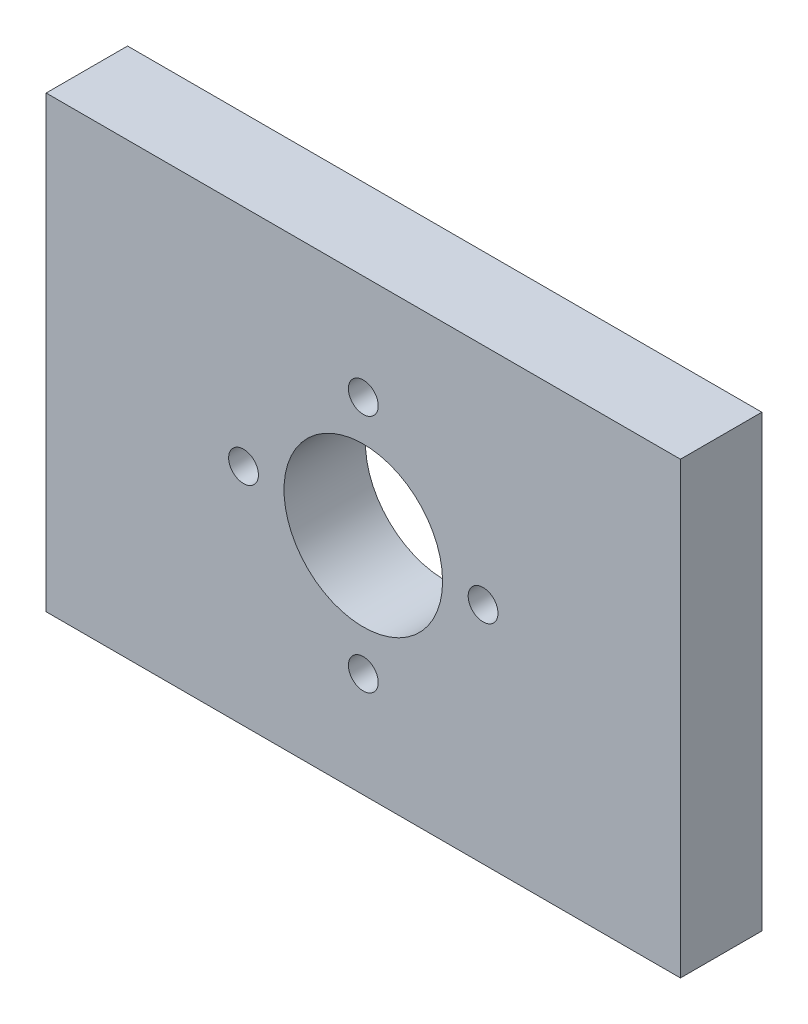
ISO-10303-21;
HEADER;
FILE_DESCRIPTION(('STEP AP214'),'2;1');
FILE_NAME('part.step','',(''),(''),'','','');
FILE_SCHEMA(('AUTOMOTIVE_DESIGN { 1 0 10303 214 1 1 1 1 }'));
ENDSEC;
DATA;
#1=APPLICATION_CONTEXT('core data for automotive mechanical design processes');
#2=APPLICATION_PROTOCOL_DEFINITION('international standard','automotive_design',2000,#1);
#3=PRODUCT_CONTEXT('',#1,'mechanical');
#4=PRODUCT('Part','Part','',(#3));
#5=PRODUCT_RELATED_PRODUCT_CATEGORY('part','',(#4));
#6=PRODUCT_DEFINITION_FORMATION('','',#4);
#7=PRODUCT_DEFINITION_CONTEXT('part definition',#1,'design');
#8=PRODUCT_DEFINITION('design','',#6,#7);
#9=PRODUCT_DEFINITION_SHAPE('','',#8);
#10=(LENGTH_UNIT() NAMED_UNIT(*) SI_UNIT(.MILLI.,.METRE.));
#11=(NAMED_UNIT(*) PLANE_ANGLE_UNIT() SI_UNIT($,.RADIAN.));
#12=(NAMED_UNIT(*) SI_UNIT($,.STERADIAN.) SOLID_ANGLE_UNIT());
#13=UNCERTAINTY_MEASURE_WITH_UNIT(LENGTH_MEASURE(1.E-05),#10,'distance_accuracy_value','');
#14=(GEOMETRIC_REPRESENTATION_CONTEXT(3) GLOBAL_UNCERTAINTY_ASSIGNED_CONTEXT((#13)) GLOBAL_UNIT_ASSIGNED_CONTEXT((#10,
#11,#12)) REPRESENTATION_CONTEXT('',''));
#15=CARTESIAN_POINT('',(0.,0.,0.));
#16=DIRECTION('',(0.,0.,1.));
#17=DIRECTION('',(1.,0.,0.));
#18=AXIS2_PLACEMENT_3D('',#15,#16,#17);
#19=CARTESIAN_POINT('',(76.2,53.975,19.558));
#20=DIRECTION('',(0.,-1.,0.));
#21=DIRECTION('',(0.,0.,-1.));
#22=AXIS2_PLACEMENT_3D('',#19,#20,#21);
#23=PLANE('',#22);
#24=DIRECTION('',(-1.,0.,0.));
#25=VECTOR('',#24,1.);
#26=CARTESIAN_POINT('',(76.2,53.975,0.));
#27=LINE('',#26,#25);
#28=CARTESIAN_POINT('',(76.2,53.975,0.));
#29=VERTEX_POINT('',#28);
#30=CARTESIAN_POINT('',(-76.2,53.975,0.));
#31=VERTEX_POINT('',#30);
#32=EDGE_CURVE('E371',#29,#31,#27,.T.);
#33=ORIENTED_EDGE('',*,*,#32,.T.);
#34=DIRECTION('',(0.,0.,-1.));
#35=VECTOR('',#34,1.);
#36=CARTESIAN_POINT('',(-76.2,53.975,19.558));
#37=LINE('',#36,#35);
#38=CARTESIAN_POINT('',(-76.2,53.975,19.558));
#39=VERTEX_POINT('',#38);
#40=EDGE_CURVE('E14',#39,#31,#37,.T.);
#41=ORIENTED_EDGE('',*,*,#40,.F.);
#42=DIRECTION('',(-1.,0.,0.));
#43=VECTOR('',#42,1.);
#44=CARTESIAN_POINT('',(76.2,53.975,19.558));
#45=LINE('',#44,#43);
#46=CARTESIAN_POINT('',(76.2,53.975,19.558));
#47=VERTEX_POINT('',#46);
#48=EDGE_CURVE('E353',#47,#39,#45,.T.);
#49=ORIENTED_EDGE('',*,*,#48,.F.);
#50=DIRECTION('',(0.,0.,-1.));
#51=VECTOR('',#50,1.);
#52=CARTESIAN_POINT('',(76.2,53.975,19.558));
#53=LINE('',#52,#51);
#54=EDGE_CURVE('E370',#47,#29,#53,.T.);
#55=ORIENTED_EDGE('',*,*,#54,.T.);
#56=EDGE_LOOP('',(#33,#41,#49,#55));
#57=FACE_BOUND('',#56,.T.);
#58=ADVANCED_FACE('F305',(#57),#23,.F.);
#59=CARTESIAN_POINT('',(-76.2,-53.975,19.558));
#60=DIRECTION('',(1.,0.,0.));
#61=DIRECTION('',(0.,0.,-1.));
#62=AXIS2_PLACEMENT_3D('',#59,#60,#61);
#63=PLANE('',#62);
#64=DIRECTION('',(0.,-1.,0.));
#65=VECTOR('',#64,1.);
#66=CARTESIAN_POINT('',(-76.2,-53.975,0.));
#67=LINE('',#66,#65);
#68=CARTESIAN_POINT('',(-76.2,-53.975,0.));
#69=VERTEX_POINT('',#68);
#70=EDGE_CURVE('E360',#31,#69,#67,.T.);
#71=ORIENTED_EDGE('',*,*,#70,.T.);
#72=DIRECTION('',(0.,0.,-1.));
#73=VECTOR('',#72,1.);
#74=CARTESIAN_POINT('',(-76.2,-53.975,19.558));
#75=LINE('',#74,#73);
#76=CARTESIAN_POINT('',(-76.2,-53.975,19.558));
#77=VERTEX_POINT('',#76);
#78=EDGE_CURVE('E311',#77,#69,#75,.T.);
#79=ORIENTED_EDGE('',*,*,#78,.F.);
#80=DIRECTION('',(0.,-1.,0.));
#81=VECTOR('',#80,1.);
#82=CARTESIAN_POINT('',(-76.2,-53.975,19.558));
#83=LINE('',#82,#81);
#84=EDGE_CURVE('E346',#39,#77,#83,.T.);
#85=ORIENTED_EDGE('',*,*,#84,.F.);
#86=ORIENTED_EDGE('',*,*,#40,.T.);
#87=EDGE_LOOP('',(#71,#79,#85,#86));
#88=FACE_BOUND('',#87,.T.);
#89=ADVANCED_FACE('F356',(#88),#63,.F.);
#90=CARTESIAN_POINT('',(76.2,-53.975,19.558));
#91=DIRECTION('',(0.,1.,0.));
#92=DIRECTION('',(0.,0.,1.));
#93=AXIS2_PLACEMENT_3D('',#90,#91,#92);
#94=PLANE('',#93);
#95=DIRECTION('',(1.,0.,0.));
#96=VECTOR('',#95,1.);
#97=CARTESIAN_POINT('',(76.2,-53.975,0.));
#98=LINE('',#97,#96);
#99=CARTESIAN_POINT('',(76.2,-53.975,0.));
#100=VERTEX_POINT('',#99);
#101=EDGE_CURVE('E337',#69,#100,#98,.T.);
#102=ORIENTED_EDGE('',*,*,#101,.T.);
#103=DIRECTION('',(0.,0.,-1.));
#104=VECTOR('',#103,1.);
#105=CARTESIAN_POINT('',(76.2,-53.975,19.558));
#106=LINE('',#105,#104);
#107=CARTESIAN_POINT('',(76.2,-53.975,19.558));
#108=VERTEX_POINT('',#107);
#109=EDGE_CURVE('E363',#108,#100,#106,.T.);
#110=ORIENTED_EDGE('',*,*,#109,.F.);
#111=DIRECTION('',(1.,0.,0.));
#112=VECTOR('',#111,1.);
#113=CARTESIAN_POINT('',(76.2,-53.975,19.558));
#114=LINE('',#113,#112);
#115=EDGE_CURVE('E355',#77,#108,#114,.T.);
#116=ORIENTED_EDGE('',*,*,#115,.F.);
#117=ORIENTED_EDGE('',*,*,#78,.T.);
#118=EDGE_LOOP('',(#102,#110,#116,#117));
#119=FACE_BOUND('',#118,.T.);
#120=ADVANCED_FACE('F365',(#119),#94,.F.);
#121=CARTESIAN_POINT('',(76.2,-53.975,19.558));
#122=DIRECTION('',(-1.,0.,0.));
#123=DIRECTION('',(0.,0.,1.));
#124=AXIS2_PLACEMENT_3D('',#121,#122,#123);
#125=PLANE('',#124);
#126=DIRECTION('',(0.,1.,0.));
#127=VECTOR('',#126,1.);
#128=CARTESIAN_POINT('',(76.2,-53.975,0.));
#129=LINE('',#128,#127);
#130=EDGE_CURVE('E345',#100,#29,#129,.T.);
#131=ORIENTED_EDGE('',*,*,#130,.T.);
#132=ORIENTED_EDGE('',*,*,#54,.F.);
#133=DIRECTION('',(0.,1.,0.));
#134=VECTOR('',#133,1.);
#135=CARTESIAN_POINT('',(76.2,-53.975,19.558));
#136=LINE('',#135,#134);
#137=EDGE_CURVE('E316',#108,#47,#136,.T.);
#138=ORIENTED_EDGE('',*,*,#137,.F.);
#139=ORIENTED_EDGE('',*,*,#109,.T.);
#140=EDGE_LOOP('',(#131,#132,#138,#139));
#141=FACE_BOUND('',#140,.T.);
#142=ADVANCED_FACE('F387',(#141),#125,.F.);
#143=CARTESIAN_POINT('',(0.,0.,19.558));
#144=DIRECTION('',(0.,0.,-1.));
#145=DIRECTION('',(-1.,0.,0.));
#146=AXIS2_PLACEMENT_3D('',#143,#144,#145);
#147=PLANE('',#146);
#148=CARTESIAN_POINT('',(0.,28.7782,19.558));
#149=DIRECTION('',(0.,0.,1.));
#150=DIRECTION('',(1.,0.,0.));
#151=AXIS2_PLACEMENT_3D('',#148,#149,#150);
#152=CIRCLE('',#151,3.5814);
#153=CARTESIAN_POINT('',(3.58139999999999,28.7782,19.558));
#154=VERTEX_POINT('',#153);
#155=EDGE_CURVE('E428',#154,#154,#152,.T.);
#156=ORIENTED_EDGE('',*,*,#155,.F.);
#157=EDGE_LOOP('',(#156));
#158=FACE_BOUND('',#157,.T.);
#159=CARTESIAN_POINT('',(28.7782,0.,19.558));
#160=DIRECTION('',(0.,0.,1.));
#161=DIRECTION('',(1.,0.,0.));
#162=AXIS2_PLACEMENT_3D('',#159,#160,#161);
#163=CIRCLE('',#162,3.5814);
#164=CARTESIAN_POINT('',(32.3596,0.,19.558));
#165=VERTEX_POINT('',#164);
#166=EDGE_CURVE('E422',#165,#165,#163,.T.);
#167=ORIENTED_EDGE('',*,*,#166,.F.);
#168=EDGE_LOOP('',(#167));
#169=FACE_BOUND('',#168,.T.);
#170=CARTESIAN_POINT('',(0.,-28.7782,19.558));
#171=DIRECTION('',(0.,0.,1.));
#172=DIRECTION('',(1.,0.,0.));
#173=AXIS2_PLACEMENT_3D('',#170,#171,#172);
#174=CIRCLE('',#173,3.5814);
#175=CARTESIAN_POINT('',(3.5814,-28.7782,19.558));
#176=VERTEX_POINT('',#175);
#177=EDGE_CURVE('E411',#176,#176,#174,.T.);
#178=ORIENTED_EDGE('',*,*,#177,.F.);
#179=EDGE_LOOP('',(#178));
#180=FACE_BOUND('',#179,.T.);
#181=CARTESIAN_POINT('',(-28.7782,0.,19.558));
#182=DIRECTION('',(0.,0.,1.));
#183=DIRECTION('',(1.,0.,0.));
#184=AXIS2_PLACEMENT_3D('',#181,#182,#183);
#185=CIRCLE('',#184,3.5814);
#186=CARTESIAN_POINT('',(-25.1968,0.,19.558));
#187=VERTEX_POINT('',#186);
#188=EDGE_CURVE('E407',#187,#187,#185,.T.);
#189=ORIENTED_EDGE('',*,*,#188,.F.);
#190=EDGE_LOOP('',(#189));
#191=FACE_BOUND('',#190,.T.);
#192=CARTESIAN_POINT('',(0.,0.,19.558));
#193=DIRECTION('',(0.,0.,1.));
#194=DIRECTION('',(1.,0.,0.));
#195=AXIS2_PLACEMENT_3D('',#192,#193,#194);
#196=CIRCLE('',#195,19.05);
#197=CARTESIAN_POINT('',(19.05,0.,19.558));
#198=VERTEX_POINT('',#197);
#199=EDGE_CURVE('E391',#198,#198,#196,.T.);
#200=ORIENTED_EDGE('',*,*,#199,.F.);
#201=EDGE_LOOP('',(#200));
#202=FACE_BOUND('',#201,.T.);
#203=ORIENTED_EDGE('',*,*,#48,.T.);
#204=ORIENTED_EDGE('',*,*,#84,.T.);
#205=ORIENTED_EDGE('',*,*,#115,.T.);
#206=ORIENTED_EDGE('',*,*,#137,.T.);
#207=EDGE_LOOP('',(#203,#204,#205,#206));
#208=FACE_BOUND('',#207,.T.);
#209=ADVANCED_FACE('F348',(#158,#169,#180,#191,#202,#208),#147,.F.);
#210=CARTESIAN_POINT('',(0.,0.,0.));
#211=DIRECTION('',(0.,0.,-1.));
#212=DIRECTION('',(-1.,0.,0.));
#213=AXIS2_PLACEMENT_3D('',#210,#211,#212);
#214=PLANE('',#213);
#215=CARTESIAN_POINT('',(0.,28.7782,0.));
#216=DIRECTION('',(0.,0.,1.));
#217=DIRECTION('',(1.,0.,0.));
#218=AXIS2_PLACEMENT_3D('',#215,#216,#217);
#219=CIRCLE('',#218,3.5814);
#220=CARTESIAN_POINT('',(3.58139999999999,28.7782,0.));
#221=VERTEX_POINT('',#220);
#222=EDGE_CURVE('E397',#221,#221,#219,.T.);
#223=ORIENTED_EDGE('',*,*,#222,.T.);
#224=EDGE_LOOP('',(#223));
#225=FACE_BOUND('',#224,.T.);
#226=CARTESIAN_POINT('',(28.7782,0.,0.));
#227=DIRECTION('',(0.,0.,1.));
#228=DIRECTION('',(1.,0.,0.));
#229=AXIS2_PLACEMENT_3D('',#226,#227,#228);
#230=CIRCLE('',#229,3.5814);
#231=CARTESIAN_POINT('',(32.3596,0.,0.));
#232=VERTEX_POINT('',#231);
#233=EDGE_CURVE('E417',#232,#232,#230,.T.);
#234=ORIENTED_EDGE('',*,*,#233,.T.);
#235=EDGE_LOOP('',(#234));
#236=FACE_BOUND('',#235,.T.);
#237=CARTESIAN_POINT('',(0.,-28.7782,0.));
#238=DIRECTION('',(0.,0.,1.));
#239=DIRECTION('',(1.,0.,0.));
#240=AXIS2_PLACEMENT_3D('',#237,#238,#239);
#241=CIRCLE('',#240,3.5814);
#242=CARTESIAN_POINT('',(3.5814,-28.7782,0.));
#243=VERTEX_POINT('',#242);
#244=EDGE_CURVE('E408',#243,#243,#241,.T.);
#245=ORIENTED_EDGE('',*,*,#244,.T.);
#246=EDGE_LOOP('',(#245));
#247=FACE_BOUND('',#246,.T.);
#248=CARTESIAN_POINT('',(-28.7782,0.,0.));
#249=DIRECTION('',(0.,0.,1.));
#250=DIRECTION('',(1.,0.,0.));
#251=AXIS2_PLACEMENT_3D('',#248,#249,#250);
#252=CIRCLE('',#251,3.5814);
#253=CARTESIAN_POINT('',(-25.1968,0.,0.));
#254=VERTEX_POINT('',#253);
#255=EDGE_CURVE('E405',#254,#254,#252,.T.);
#256=ORIENTED_EDGE('',*,*,#255,.T.);
#257=EDGE_LOOP('',(#256));
#258=FACE_BOUND('',#257,.T.);
#259=CARTESIAN_POINT('',(0.,0.,0.));
#260=DIRECTION('',(0.,0.,1.));
#261=DIRECTION('',(1.,0.,0.));
#262=AXIS2_PLACEMENT_3D('',#259,#260,#261);
#263=CIRCLE('',#262,19.05);
#264=CARTESIAN_POINT('',(19.05,0.,0.));
#265=VERTEX_POINT('',#264);
#266=EDGE_CURVE('E374',#265,#265,#263,.T.);
#267=ORIENTED_EDGE('',*,*,#266,.T.);
#268=EDGE_LOOP('',(#267));
#269=FACE_BOUND('',#268,.T.);
#270=ORIENTED_EDGE('',*,*,#32,.F.);
#271=ORIENTED_EDGE('',*,*,#130,.F.);
#272=ORIENTED_EDGE('',*,*,#101,.F.);
#273=ORIENTED_EDGE('',*,*,#70,.F.);
#274=EDGE_LOOP('',(#270,#271,#272,#273));
#275=FACE_BOUND('',#274,.T.);
#276=ADVANCED_FACE('F386',(#225,#236,#247,#258,#269,#275),#214,.T.);
#277=CARTESIAN_POINT('',(0.,0.,0.));
#278=DIRECTION('',(0.,0.,1.));
#279=DIRECTION('',(1.,0.,0.));
#280=AXIS2_PLACEMENT_3D('',#277,#278,#279);
#281=CYLINDRICAL_SURFACE('',#280,19.05);
#282=ORIENTED_EDGE('',*,*,#266,.F.);
#283=EDGE_LOOP('',(#282));
#284=FACE_BOUND('',#283,.T.);
#285=ORIENTED_EDGE('',*,*,#199,.T.);
#286=EDGE_LOOP('',(#285));
#287=FACE_BOUND('',#286,.T.);
#288=ADVANCED_FACE('F453',(#284,#287),#281,.F.);
#289=CARTESIAN_POINT('',(-28.7782,0.,0.));
#290=DIRECTION('',(0.,0.,1.));
#291=DIRECTION('',(1.,0.,0.));
#292=AXIS2_PLACEMENT_3D('',#289,#290,#291);
#293=CYLINDRICAL_SURFACE('',#292,3.5814);
#294=ORIENTED_EDGE('',*,*,#255,.F.);
#295=EDGE_LOOP('',(#294));
#296=FACE_BOUND('',#295,.T.);
#297=ORIENTED_EDGE('',*,*,#188,.T.);
#298=EDGE_LOOP('',(#297));
#299=FACE_BOUND('',#298,.T.);
#300=ADVANCED_FACE('F460',(#296,#299),#293,.F.);
#301=CARTESIAN_POINT('',(0.,-28.7782,0.));
#302=DIRECTION('',(0.,0.,1.));
#303=DIRECTION('',(1.,0.,0.));
#304=AXIS2_PLACEMENT_3D('',#301,#302,#303);
#305=CYLINDRICAL_SURFACE('',#304,3.5814);
#306=ORIENTED_EDGE('',*,*,#244,.F.);
#307=EDGE_LOOP('',(#306));
#308=FACE_BOUND('',#307,.T.);
#309=ORIENTED_EDGE('',*,*,#177,.T.);
#310=EDGE_LOOP('',(#309));
#311=FACE_BOUND('',#310,.T.);
#312=ADVANCED_FACE('F463',(#308,#311),#305,.F.);
#313=CARTESIAN_POINT('',(28.7782,0.,0.));
#314=DIRECTION('',(0.,0.,1.));
#315=DIRECTION('',(1.,0.,0.));
#316=AXIS2_PLACEMENT_3D('',#313,#314,#315);
#317=CYLINDRICAL_SURFACE('',#316,3.5814);
#318=ORIENTED_EDGE('',*,*,#233,.F.);
#319=EDGE_LOOP('',(#318));
#320=FACE_BOUND('',#319,.T.);
#321=ORIENTED_EDGE('',*,*,#166,.T.);
#322=EDGE_LOOP('',(#321));
#323=FACE_BOUND('',#322,.T.);
#324=ADVANCED_FACE('F439',(#320,#323),#317,.F.);
#325=CARTESIAN_POINT('',(0.,28.7782,0.));
#326=DIRECTION('',(0.,0.,1.));
#327=DIRECTION('',(1.,0.,0.));
#328=AXIS2_PLACEMENT_3D('',#325,#326,#327);
#329=CYLINDRICAL_SURFACE('',#328,3.5814);
#330=ORIENTED_EDGE('',*,*,#222,.F.);
#331=EDGE_LOOP('',(#330));
#332=FACE_BOUND('',#331,.T.);
#333=ORIENTED_EDGE('',*,*,#155,.T.);
#334=EDGE_LOOP('',(#333));
#335=FACE_BOUND('',#334,.T.);
#336=ADVANCED_FACE('F440',(#332,#335),#329,.F.);
#337=CLOSED_SHELL('',(#58,#89,#120,#142,#209,#276,#288,#300,#312,#324,#336));
#338=MANIFOLD_SOLID_BREP('B2',#337);
#339=ADVANCED_BREP_SHAPE_REPRESENTATION('',(#18,#338),#14);
#340=SHAPE_DEFINITION_REPRESENTATION(#9,#339);
ENDSEC;
END-ISO-10303-21;
